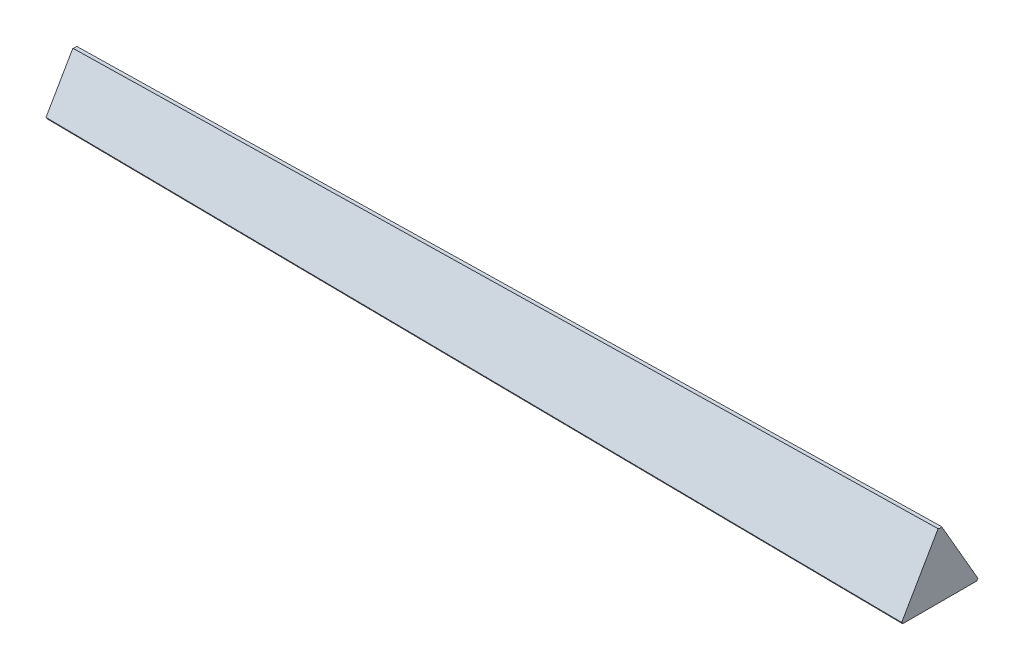
ISO-10303-21;
HEADER;
FILE_DESCRIPTION(('STEP AP214'),'2;1');
FILE_NAME('part.step','',(''),(''),'','','');
FILE_SCHEMA(('AUTOMOTIVE_DESIGN { 1 0 10303 214 1 1 1 1 }'));
ENDSEC;
DATA;
#1=APPLICATION_CONTEXT('core data for automotive mechanical design processes');
#2=APPLICATION_PROTOCOL_DEFINITION('international standard','automotive_design',2000,#1);
#3=PRODUCT_CONTEXT('',#1,'mechanical');
#4=PRODUCT('Part','Part','',(#3));
#5=PRODUCT_RELATED_PRODUCT_CATEGORY('part','',(#4));
#6=PRODUCT_DEFINITION_FORMATION('','',#4);
#7=PRODUCT_DEFINITION_CONTEXT('part definition',#1,'design');
#8=PRODUCT_DEFINITION('design','',#6,#7);
#9=PRODUCT_DEFINITION_SHAPE('','',#8);
#10=(LENGTH_UNIT() NAMED_UNIT(*) SI_UNIT(.MILLI.,.METRE.));
#11=(NAMED_UNIT(*) PLANE_ANGLE_UNIT() SI_UNIT($,.RADIAN.));
#12=(NAMED_UNIT(*) SI_UNIT($,.STERADIAN.) SOLID_ANGLE_UNIT());
#13=UNCERTAINTY_MEASURE_WITH_UNIT(LENGTH_MEASURE(1.E-05),#10,'distance_accuracy_value','');
#14=(GEOMETRIC_REPRESENTATION_CONTEXT(3) GLOBAL_UNCERTAINTY_ASSIGNED_CONTEXT((#13)) GLOBAL_UNIT_ASSIGNED_CONTEXT((#10,
#11,#12)) REPRESENTATION_CONTEXT('',''));
#15=CARTESIAN_POINT('',(0.,0.,0.));
#16=DIRECTION('',(0.,0.,1.));
#17=DIRECTION('',(1.,0.,0.));
#18=AXIS2_PLACEMENT_3D('',#15,#16,#17);
#19=CARTESIAN_POINT('',(3657.6,200.,0.));
#20=DIRECTION('',(-1.,0.,0.));
#21=DIRECTION('',(0.,-1.,0.));
#22=AXIS2_PLACEMENT_3D('',#19,#20,#21);
#23=PLANE('',#22);
#24=CARTESIAN_POINT('',(3657.6,0.,-55.1011032125769));
#25=DIRECTION('',(1.,0.,0.));
#26=DIRECTION('',(0.,1.,0.));
#27=AXIS2_PLACEMENT_3D('',#24,#25,#26);
#28=CIRCLE('',#27,2.667);
#29=CARTESIAN_POINT('',(3657.6,2.3094718557166,-53.7672258765175));
#30=VERTEX_POINT('',#29);
#31=CARTESIAN_POINT('',(3657.6,0.,-52.4341032125769));
#32=VERTEX_POINT('',#31);
#33=EDGE_CURVE('E135',#30,#32,#28,.T.);
#34=ORIENTED_EDGE('',*,*,#33,.F.);
#35=CARTESIAN_POINT('',(3657.6,0.,-55.1011032125769));
#36=CARTESIAN_POINT('',(3657.6,13.7742056459925,-47.1455610448161));
#37=CARTESIAN_POINT('',(3657.6,27.5484112919851,-39.1900188770553));
#38=CARTESIAN_POINT('',(3657.6,50.335832638563,-26.0287305910787));
#39=CARTESIAN_POINT('',(3657.6,59.3490483391484,-20.822984472863));
#40=CARTESIAN_POINT('',(3657.6,77.3754797403192,-10.4114922364315));
#41=CARTESIAN_POINT('',(3657.6,86.3886954409047,-5.20574611821575));
#42=CARTESIAN_POINT('',(3657.6,95.4019111414901,0.));
#43=B_SPLINE_CURVE_WITH_KNOTS('',3,(#35,#36,#37,#38,#39,#40,#41,#42),.UNSPECIFIED.,.F.,.F.,(4,2,
2,4),(0.,47.7197499076642,78.9453908012212,110.171031694778),.UNSPECIFIED.);
#44=CARTESIAN_POINT('',(3657.6,91.0689020407646,-2.50260795432091));
#45=VERTEX_POINT('',#44);
#46=EDGE_CURVE('E141',#30,#45,#43,.T.);
#47=ORIENTED_EDGE('',*,*,#46,.T.);
#48=CARTESIAN_POINT('',(3657.6,95.4019111414901,0.));
#49=DIRECTION('',(1.,0.,0.));
#50=DIRECTION('',(0.,1.,0.));
#51=AXIS2_PLACEMENT_3D('',#48,#49,#50);
#52=CIRCLE('',#51,5.0038);
#53=CARTESIAN_POINT('',(3657.6,91.0689020407646,2.5026079543209));
#54=VERTEX_POINT('',#53);
#55=EDGE_CURVE('E259',#54,#45,#52,.T.);
#56=ORIENTED_EDGE('',*,*,#55,.F.);
#57=CARTESIAN_POINT('',(3657.6,95.4019111414901,0.));
#58=CARTESIAN_POINT('',(3657.6,81.6277054954975,7.95554216776079));
#59=CARTESIAN_POINT('',(3657.6,67.853499849505,15.9110843355216));
#60=CARTESIAN_POINT('',(3657.6,45.066078502927,29.0723726214982));
#61=CARTESIAN_POINT('',(3657.6,36.0528628023416,34.278118739714));
#62=CARTESIAN_POINT('',(3657.6,18.0264314011708,44.6896109761454));
#63=CARTESIAN_POINT('',(3657.6,9.0132157005854,49.8953570943612));
#64=CARTESIAN_POINT('',(3657.6,0.,55.1011032125769));
#65=B_SPLINE_CURVE_WITH_KNOTS('',3,(#57,#58,#59,#60,#61,#62,#63,#64),.UNSPECIFIED.,.F.,.F.,(4,2,
2,4),(0.,47.7197499076642,78.9453908012212,110.171031694778),.UNSPECIFIED.);
#66=CARTESIAN_POINT('',(3657.6,2.30947185571662,53.7672258765175));
#67=VERTEX_POINT('',#66);
#68=EDGE_CURVE('E190',#54,#67,#65,.T.);
#69=ORIENTED_EDGE('',*,*,#68,.T.);
#70=CARTESIAN_POINT('',(3657.6,0.,55.1011032125769));
#71=DIRECTION('',(1.,0.,0.));
#72=DIRECTION('',(0.,1.,0.));
#73=AXIS2_PLACEMENT_3D('',#70,#71,#72);
#74=CIRCLE('',#73,2.667);
#75=CARTESIAN_POINT('',(3657.6,0.,52.4341032125769));
#76=VERTEX_POINT('',#75);
#77=EDGE_CURVE('E261',#76,#67,#74,.T.);
#78=ORIENTED_EDGE('',*,*,#77,.F.);
#79=DIRECTION('',(0.,0.,-1.));
#80=VECTOR('',#79,1.);
#81=CARTESIAN_POINT('',(3657.6,0.,0.));
#82=LINE('',#81,#80);
#83=EDGE_CURVE('E182',#76,#32,#82,.T.);
#84=ORIENTED_EDGE('',*,*,#83,.T.);
#85=EDGE_LOOP('',(#34,#47,#56,#69,#78,#84));
#86=FACE_BOUND('',#85,.T.);
#87=ADVANCED_FACE('F120',(#86),#23,.F.);
#88=CARTESIAN_POINT('',(2438.4,200.,0.));
#89=DIRECTION('',(-1.,0.,0.));
#90=DIRECTION('',(0.,-1.,0.));
#91=AXIS2_PLACEMENT_3D('',#88,#89,#90);
#92=PLANE('',#91);
#93=CARTESIAN_POINT('',(2438.4,0.,-41.6507354750513));
#94=CARTESIAN_POINT('',(2438.4,12.0168790157211,-34.7089462292094));
#95=CARTESIAN_POINT('',(2438.4,24.0337580314422,-27.7671569833675));
#96=CARTESIAN_POINT('',(2438.4,48.0675160628845,-13.8835784916838));
#97=CARTESIAN_POINT('',(2438.4,60.0843950786056,-6.94178924584188));
#98=CARTESIAN_POINT('',(2438.4,72.1012740943267,0.));
#99=B_SPLINE_CURVE_WITH_KNOTS('',3,(#93,#94,#95,#96,#97,#98),.UNSPECIFIED.,.F.,.F.,(4,2,4),(0.,
41.6334525701326,83.2669051402652),.UNSPECIFIED.);
#100=CARTESIAN_POINT('',(2438.4,2.30937006348012,-40.3166819116956));
#101=VERTEX_POINT('',#100);
#102=CARTESIAN_POINT('',(2438.4,67.7684559752259,-2.50293859029578));
#103=VERTEX_POINT('',#102);
#104=EDGE_CURVE('E187',#101,#103,#99,.T.);
#105=ORIENTED_EDGE('',*,*,#104,.F.);
#106=CARTESIAN_POINT('',(2438.4,0.,-41.6507354750512));
#107=DIRECTION('',(-1.,0.,0.));
#108=DIRECTION('',(0.,0.,1.));
#109=AXIS2_PLACEMENT_3D('',#106,#107,#108);
#110=CIRCLE('',#109,2.667);
#111=CARTESIAN_POINT('',(2438.4,0.,-38.9837354750512));
#112=VERTEX_POINT('',#111);
#113=EDGE_CURVE('E174',#112,#101,#110,.T.);
#114=ORIENTED_EDGE('',*,*,#113,.F.);
#115=DIRECTION('',(0.,0.,-1.));
#116=VECTOR('',#115,1.);
#117=CARTESIAN_POINT('',(2438.4,0.,0.));
#118=LINE('',#117,#116);
#119=CARTESIAN_POINT('',(2438.4,0.,38.9837354750512));
#120=VERTEX_POINT('',#119);
#121=EDGE_CURVE('E188',#120,#112,#118,.T.);
#122=ORIENTED_EDGE('',*,*,#121,.F.);
#123=CARTESIAN_POINT('',(2438.4,0.,41.6507354750512));
#124=DIRECTION('',(-1.,0.,0.));
#125=DIRECTION('',(0.,0.,1.));
#126=AXIS2_PLACEMENT_3D('',#123,#124,#125);
#127=CIRCLE('',#126,2.667);
#128=CARTESIAN_POINT('',(2438.4,2.30937006348016,40.3166819116957));
#129=VERTEX_POINT('',#128);
#130=EDGE_CURVE('E258',#129,#120,#127,.T.);
#131=ORIENTED_EDGE('',*,*,#130,.F.);
#132=CARTESIAN_POINT('',(2438.4,72.1012740943267,0.));
#133=CARTESIAN_POINT('',(2438.4,60.0843950786056,6.94178924584188));
#134=CARTESIAN_POINT('',(2438.4,48.0675160628845,13.8835784916837));
#135=CARTESIAN_POINT('',(2438.4,24.0337580314422,27.7671569833675));
#136=CARTESIAN_POINT('',(2438.4,12.0168790157211,34.7089462292094));
#137=CARTESIAN_POINT('',(2438.4,0.,41.6507354750513));
#138=B_SPLINE_CURVE_WITH_KNOTS('',3,(#132,#133,#134,#135,#136,#137),.UNSPECIFIED.,.F.,.F.,(4,2,
4),(0.,41.6334525701326,83.2669051402652),.UNSPECIFIED.);
#139=CARTESIAN_POINT('',(2438.4,67.7684559752259,2.50293859029572));
#140=VERTEX_POINT('',#139);
#141=EDGE_CURVE('E222',#140,#129,#138,.T.);
#142=ORIENTED_EDGE('',*,*,#141,.F.);
#143=CARTESIAN_POINT('',(2438.4,72.1012740943267,0.));
#144=DIRECTION('',(-1.,0.,0.));
#145=DIRECTION('',(0.,0.,1.));
#146=AXIS2_PLACEMENT_3D('',#143,#144,#145);
#147=CIRCLE('',#146,5.0038);
#148=EDGE_CURVE('E177',#103,#140,#147,.T.);
#149=ORIENTED_EDGE('',*,*,#148,.F.);
#150=EDGE_LOOP('',(#105,#114,#122,#131,#142,#149));
#151=FACE_BOUND('',#150,.T.);
#152=ADVANCED_FACE('F210',(#151),#92,.T.);
#153=CARTESIAN_POINT('',(0.,0.,-14.75));
#154=CARTESIAN_POINT('',(2438.33333333333,0.,-41.65));
#155=CARTESIAN_POINT('',(4876.66666666667,0.,-68.55));
#156=CARTESIAN_POINT('',(7315.,0.,-95.45));
#157=CARTESIAN_POINT('',(0.,2.125,-13.5208333333333));
#158=CARTESIAN_POINT('',(2438.33333333333,6.00833333333332,-38.1791666666667));
#159=CARTESIAN_POINT('',(4876.66666666667,9.89166666666665,-62.8375));
#160=CARTESIAN_POINT('',(7315.,13.775,-87.4958333333333));
#161=CARTESIAN_POINT('',(0.,6.37500000000001,-11.0625));
#162=CARTESIAN_POINT('',(2438.33333333334,18.025,-31.2375));
#163=CARTESIAN_POINT('',(4876.66666666667,29.6750000000001,-51.4125000000001));
#164=CARTESIAN_POINT('',(7315.00000000001,41.3250000000001,-71.5875));
#165=CARTESIAN_POINT('',(0.,12.75,-7.37499999999997));
#166=CARTESIAN_POINT('',(2438.33333333333,36.05,-20.825));
#167=CARTESIAN_POINT('',(4876.66666666666,59.3499999999999,-34.275));
#168=CARTESIAN_POINT('',(7314.99999999999,82.6499999999999,-47.725));
#169=CARTESIAN_POINT('',(0.,19.125,-3.68750000000001));
#170=CARTESIAN_POINT('',(2438.33333333333,54.075,-10.4125));
#171=CARTESIAN_POINT('',(4876.66666666667,89.025,-17.1375));
#172=CARTESIAN_POINT('',(7315.,123.975,-23.8625));
#173=CARTESIAN_POINT('',(0.,23.375,-1.22916666666666));
#174=CARTESIAN_POINT('',(2438.33333333333,66.0916666666667,-3.47083333333334));
#175=CARTESIAN_POINT('',(4876.66666666667,108.808333333333,-5.71250000000001));
#176=CARTESIAN_POINT('',(7315.,151.525,-7.95416666666669));
#177=CARTESIAN_POINT('',(0.,25.5,0.));
#178=CARTESIAN_POINT('',(2438.33333333333,72.1,0.));
#179=CARTESIAN_POINT('',(4876.66666666667,118.7,0.));
#180=CARTESIAN_POINT('',(7315.,165.3,0.));
#181=B_SPLINE_SURFACE_WITH_KNOTS('',3,3,((#153,#154,#155,#156),(#157,#158,#159,#160),(#161,#162,
#163,#164),(#165,#166,#167,#168),(#169,#170,#171,#172),(#173,#174,#175,#176),(#177,#178,#179,
#180)),.UNSPECIFIED.,.F.,.F.,.F.,(4,1,1,1,4),(4,4),(0.666750709304579,0.750063031978434,
0.833375354652289,0.916687677326145,1.),(0.,1.),.UNSPECIFIED.);
#182=CARTESIAN_POINT('',(3657.6,2.3094718557166,-53.7672258765175));
#183=CARTESIAN_POINT('',(3655.82232454747,2.30947174354873,-53.7476141431416));
#184=CARTESIAN_POINT('',(3654.04464909494,2.30947163126102,-53.7280024095582));
#185=CARTESIAN_POINT('',(3645.15627183229,2.30947106922134,-53.6299437406012));
#186=CARTESIAN_POINT('',(3638.04557002222,2.30947061766597,-53.5514968021063));
#187=CARTESIAN_POINT('',(3623.82416640214,2.30946971065826,-53.3946029183721));
#188=CARTESIAN_POINT('',(3616.71346459214,2.30946925520591,-53.3161559731327));
#189=CARTESIAN_POINT('',(3602.49206097221,2.30946834035357,-53.1592620758218));
#190=CARTESIAN_POINT('',(3595.38135916228,2.30946788095358,-53.0808151237502));
#191=CARTESIAN_POINT('',(3581.1599555425,2.30946695815439,-52.9239212126856));
#192=CARTESIAN_POINT('',(3574.04925373265,2.30946649475521,-52.8454742536927));
#193=CARTESIAN_POINT('',(3559.82785011303,2.30946556390519,-52.6885803286946));
#194=CARTESIAN_POINT('',(3552.71714830325,2.30946509645436,-52.6101333626895));
#195=CARTESIAN_POINT('',(3538.49574468379,2.3094641574477,-52.4532394235749));
#196=CARTESIAN_POINT('',(3531.38504287409,2.30946368589187,-52.3747924504653));
#197=CARTESIAN_POINT('',(3520.71899015961,2.30946297543861,-52.2571219854021));
#198=CARTESIAN_POINT('',(3517.16363925479,2.30946273810094,-52.2178984961479));
#199=CARTESIAN_POINT('',(3506.49758654037,2.30946202451785,-52.100228025668));
#200=CARTESIAN_POINT('',(3499.38688473079,2.30946154670234,-52.021781041725));
#201=CARTESIAN_POINT('',(3485.16548111172,2.30946058682874,-51.8648870664964));
#202=CARTESIAN_POINT('',(3478.05477930223,2.30946010477065,-51.7864400752109));
#203=CARTESIAN_POINT('',(3463.83337568332,2.3094591363551,-51.6295460851992));
#204=CARTESIAN_POINT('',(3456.72267387391,2.30945864999764,-51.5510990864729));
#205=CARTESIAN_POINT('',(3446.05662115985,2.30945791719359,-51.433428582728));
#206=CARTESIAN_POINT('',(3442.50127025518,2.30945767238093,-51.3942050805371));
#207=CARTESIAN_POINT('',(3431.83521754118,2.30945693629803,-51.2765345711176));
#208=CARTESIAN_POINT('',(3424.72451573189,2.30945644338289,-51.1980875610423));
#209=CARTESIAN_POINT('',(3410.50311211341,2.30945545310684,-51.0411935331976));
#210=CARTESIAN_POINT('',(3403.3924103042,2.30945495574594,-50.9627465154283));
#211=CARTESIAN_POINT('',(3389.17100668588,2.30945395651795,-50.805852472091));
#212=CARTESIAN_POINT('',(3382.06030487677,2.30945345465087,-50.7274054465231));
#213=CARTESIAN_POINT('',(3367.83890125862,2.30945244634903,-50.5705113874823));
#214=CARTESIAN_POINT('',(3360.72819944959,2.30945193991427,-50.4920643540095));
#215=CARTESIAN_POINT('',(3350.06214673612,2.30945117678935,-50.3743937977901));
#216=CARTESIAN_POINT('',(3346.50679583163,2.30945092183559,-50.3351702780487));
#217=CARTESIAN_POINT('',(3335.84074311822,2.30945015522599,-50.2174997157986));
#218=CARTESIAN_POINT('',(3328.73004130933,2.30944964182186,-50.1390526702644));
#219=CARTESIAN_POINT('',(3314.50863769163,2.30944861028716,-49.9821585710164));
#220=CARTESIAN_POINT('',(3307.39793588282,2.3094480921566,-49.9037115173025));
#221=CARTESIAN_POINT('',(3293.1765322653,2.30944705110339,-49.7468174015817));
#222=CARTESIAN_POINT('',(3286.06583045659,2.30944652818075,-49.6683703395747));
#223=CARTESIAN_POINT('',(3271.84442683925,2.30944547747668,-49.511476207152));
#224=CARTESIAN_POINT('',(3264.73372503063,2.30944494969526,-49.4330291367364));
#225=CARTESIAN_POINT('',(3254.06767231777,2.30944415432795,-49.3153585247181));
#226=CARTESIAN_POINT('',(3250.51232141349,2.30944388858964,-49.2761349863128));
#227=CARTESIAN_POINT('',(3239.8462687007,2.30944308951422,-49.1584643678773));
#228=CARTESIAN_POINT('',(3232.73556689222,2.30944255431657,-49.0800172846272));
#229=CARTESIAN_POINT('',(3218.51416327536,2.30944147888997,-48.92312310942));
#230=CARTESIAN_POINT('',(3211.40346146697,2.30944093866102,-48.8446760174628));
#231=CARTESIAN_POINT('',(3197.1820578503,2.30943985310054,-48.6877818247181));
#232=CARTESIAN_POINT('',(3190.07135604202,2.309439307769,-48.6093347239306));
#233=CARTESIAN_POINT('',(3179.40530332966,2.30943848589022,-48.4916640660321));
#234=CARTESIAN_POINT('',(3175.84995242556,2.30943821128371,-48.4524405122798));
#235=CARTESIAN_POINT('',(3165.18389971328,2.30943738550966,-48.3347698476403));
#236=CARTESIAN_POINT('',(3158.07319790514,2.30943683238758,-48.2563227333708));
#237=CARTESIAN_POINT('',(3143.85179428896,2.30943572085665,-48.0994284956825));
#238=CARTESIAN_POINT('',(3136.74109248093,2.3094351624478,-48.0209813722639));
#239=CARTESIAN_POINT('',(3122.51968886496,2.30943404026713,-47.8640871161457));
#240=CARTESIAN_POINT('',(3115.40898705702,2.30943347649531,-47.7856399834462));
#241=CARTESIAN_POINT('',(3101.18758344126,2.30943234351111,-47.6287457086321));
#242=CARTESIAN_POINT('',(3094.07688163343,2.30943177429872,-47.5502985665174));
#243=CARTESIAN_POINT('',(3083.41082892176,2.30943091634031,-47.4326278461814));
#244=CARTESIAN_POINT('',(3079.85547801789,2.3094306296642,-47.393404271542));
#245=CARTESIAN_POINT('',(3069.1894253063,2.30942976755091,-47.2757335440158));
#246=CARTESIAN_POINT('',(3062.07872349863,2.30942919002877,-47.1972863875209));
#247=CARTESIAN_POINT('',(3047.85731988339,2.30942802934316,-47.0403920647687));
#248=CARTESIAN_POINT('',(3040.74661807583,2.30942744617969,-46.9619448985114));
#249=CARTESIAN_POINT('',(3026.52521446081,2.30942627412836,-46.8050505560905));
#250=CARTESIAN_POINT('',(3019.41451265335,2.30942568524051,-46.7266033799271));
#251=CARTESIAN_POINT('',(3005.19310903855,2.30942450165571,-46.5697090175475));
#252=CARTESIAN_POINT('',(2998.08240723121,2.30942390695876,-46.4912618313314));
#253=CARTESIAN_POINT('',(2987.41635452028,2.3094230104917,-46.3735910443555));
#254=CARTESIAN_POINT('',(2983.86100361665,2.30942271093241,-46.3343674474217));
#255=CARTESIAN_POINT('',(2973.1949509058,2.30942181002728,-46.2166966527658));
#256=CARTESIAN_POINT('',(2966.08424909863,2.30942120645418,-46.1382494511895));
#257=CARTESIAN_POINT('',(2951.86284548439,2.30941999327969,-45.9813550376051));
#258=CARTESIAN_POINT('',(2944.75214367733,2.30941938367831,-45.902907825597));
#259=CARTESIAN_POINT('',(2930.53074006333,2.30941815835651,-45.746013390992));
#260=CARTESIAN_POINT('',(2923.42003825639,2.30941754263609,-45.667566168395));
#261=CARTESIAN_POINT('',(2912.75398554606,2.30941661439667,-45.5498953264376));
#262=CARTESIAN_POINT('',(2909.19863464264,2.30941630420707,-45.5106717111082));
#263=CARTESIAN_POINT('',(2898.5325819324,2.30941537129125,-45.3930008610586));
#264=CARTESIAN_POINT('',(2891.42188012564,2.30941474621801,-45.3145536222769));
#265=CARTESIAN_POINT('',(2877.20047651223,2.30941348971748,-45.1576591337181));
#266=CARTESIAN_POINT('',(2870.08977470559,2.3094128582902,-45.079211883941));
#267=CARTESIAN_POINT('',(2855.86837109243,2.30941158898417,-44.9223173732229));
#268=CARTESIAN_POINT('',(2848.75766928591,2.30941095110542,-44.8438701122818));
#269=CARTESIAN_POINT('',(2834.53626567299,2.30940966879706,-44.686975579064));
#270=CARTESIAN_POINT('',(2827.4255638666,2.30940902436745,-44.6085283067872));
#271=CARTESIAN_POINT('',(2816.7595111571,2.30940805273382,-44.4908573897384));
#272=CARTESIAN_POINT('',(2813.20416025396,2.30940772802441,-44.4516337492832));
#273=CARTESIAN_POINT('',(2802.53810754456,2.30940675138222,-44.3339628235675));
#274=CARTESIAN_POINT('',(2795.42740573835,2.30940609693548,-44.2555155339567));
#275=CARTESIAN_POINT('',(2781.20600212608,2.30940478123368,-44.0986209429539));
#276=CARTESIAN_POINT('',(2774.09530032,2.3094041199786,-44.0201736415618));
#277=CARTESIAN_POINT('',(2759.87389670799,2.30940279055322,-43.8632790268116));
#278=CARTESIAN_POINT('',(2752.76319490205,2.30940212238292,-43.7848317134534));
#279=CARTESIAN_POINT('',(2738.5417912903,2.30940077901813,-43.6279370745824));
#280=CARTESIAN_POINT('',(2731.43108948449,2.30940010382364,-43.5494897490695));
#281=CARTESIAN_POINT('',(2720.76503677588,2.30939908568015,-43.4318187515396));
#282=CARTESIAN_POINT('',(2717.20968587303,2.30939874540703,-43.3925950841529));
#283=CARTESIAN_POINT('',(2706.54363316453,2.30939772189059,-43.2749240773257));
#284=CARTESIAN_POINT('',(2699.43293135892,2.30939703595021,-43.1964767332183));
#285=CARTESIAN_POINT('',(2685.21152774786,2.30939565676239,-43.0395820323595));
#286=CARTESIAN_POINT('',(2678.1008259424,2.30939496351494,-42.9611346756082));
#287=CARTESIAN_POINT('',(2663.87942233161,2.30939356959562,-42.8042399492585));
#288=CARTESIAN_POINT('',(2656.76872052629,2.30939286892375,-42.7257925796602));
#289=CARTESIAN_POINT('',(2646.10266781842,2.30939181225764,-42.6081215154717));
#290=CARTESIAN_POINT('',(2642.54731691581,2.30939145909255,-42.5688978257771));
#291=CARTESIAN_POINT('',(2631.88126420805,2.30939039674527,-42.4512267517582));
#292=CARTESIAN_POINT('',(2624.77056240295,2.30938968471104,-42.372779362499));
#293=CARTESIAN_POINT('',(2610.54915879289,2.30938825291354,-42.2158845706067));
#294=CARTESIAN_POINT('',(2603.43845698793,2.30938753315027,-42.1374371679735));
#295=CARTESIAN_POINT('',(2589.21705337817,2.30938608576802,-41.9805423491142));
#296=CARTESIAN_POINT('',(2582.10635157336,2.30938535814906,-41.9020949328881));
#297=CARTESIAN_POINT('',(2567.8849479639,2.30938389492622,-41.7452000866195));
#298=CARTESIAN_POINT('',(2560.77424615925,2.30938315932236,-41.6667526565769));
#299=CARTESIAN_POINT('',(2550.10819345238,2.30938204982863,-41.549081500979));
#300=CARTESIAN_POINT('',(2546.55284255011,2.30938167898273,-41.5098577806907));
#301=CARTESIAN_POINT('',(2535.88678984336,2.30938056337591,-41.3921866145153));
#302=CARTESIAN_POINT('',(2528.77608803894,2.30937981554584,-41.3137391633176));
#303=CARTESIAN_POINT('',(2514.55468443026,2.30937831156482,-41.1568442465246));
#304=CARTESIAN_POINT('',(2507.443982626,2.30937755541386,-41.0783967809293));
#305=CARTESIAN_POINT('',(2493.22257901764,2.3093760346514,-40.9215018350995));
#306=CARTESIAN_POINT('',(2486.11187721354,2.30937527003988,-40.843054354865));
#307=CARTESIAN_POINT('',(2472.23431284112,2.30937376939455,-40.6899527215657));
#308=CARTESIAN_POINT('',(2465.46745027279,2.30937303376668,-40.6152985692033));
#309=CARTESIAN_POINT('',(2451.93372513628,2.30937155459327,-40.4659902507789));
#310=CARTESIAN_POINT('',(2445.1668625681,2.30937081104772,-40.3913360847169));
#311=CARTESIAN_POINT('',(2438.4,2.30937006348015,-40.3166819116957));
#312=B_SPLINE_CURVE_WITH_KNOTS('',3,(#182,#183,#184,#185,#186,#187,#188,#189,#190,#191,#192,
#193,#194,#195,#196,#197,#198,#199,#200,#201,#202,#203,#204,#205,#206,#207,#208,#209,#210,#211,
#212,#213,#214,#215,#216,#217,#218,#219,#220,#221,#222,#223,#224,#225,#226,#227,#228,#229,#230,
#231,#232,#233,#234,#235,#236,#237,#238,#239,#240,#241,#242,#243,#244,#245,#246,#247,#248,#249,
#250,#251,#252,#253,#254,#255,#256,#257,#258,#259,#260,#261,#262,#263,#264,#265,#266,#267,#268,
#269,#270,#271,#272,#273,#274,#275,#276,#277,#278,#279,#280,#281,#282,#283,#284,#285,#286,#287,
#288,#289,#290,#291,#292,#293,#294,#295,#296,#297,#298,#299,#300,#301,#302,#303,#304,#305,#306,
#307,#308,#309,#310,#311),.UNSPECIFIED.,.F.,.F.,(4,2,2,2,2,2,2,2,2,2,2,2,2,2,2,2,2,2,2,2,2,2,2,
2,2,2,2,2,2,2,2,2,2,2,2,2,2,2,2,2,2,2,2,2,2,2,2,2,2,2,2,2,2,2,2,2,2,2,2,2,2,2,2,2,4),(0.,
5.33335088960192,26.6667544480092,48.0001580064177,69.3335615648268,90.6669651232344,
112.000368681642,133.33377224005,144.000474019255,165.333877577664,186.667281136072,
208.00068469448,218.667386473685,240.000790032094,261.334193590502,282.667597148911,
304.00100070732,314.667702486523,336.001106044931,357.334509603339,378.667913161747,
400.001316720155,410.668018499359,432.001422057768,453.334825616176,474.668229174584,
485.334930953788,506.668334512196,528.001738070604,549.335141629012,570.66854518742,
581.335246966624,602.668650525033,624.00205408344,645.335457641849,666.668861200257,
677.335562979461,698.668966537869,720.002370096277,741.335773654686,752.00247543389,
773.335878992298,794.669282550706,816.002686109113,837.336089667521,848.002791446724,
869.336195005132,890.66959856354,912.003002121948,933.336405680355,944.00310745956,
965.336511017967,986.669914576375,1008.00331813478,1018.67001991399,1040.0034234724,
1061.3368270308,1082.67023058921,1104.00363414762,1114.67033592682,1136.00373948523,
1157.33714304364,1178.67054660205,1198.97236968152,1219.27419276099),.UNSPECIFIED.);
#313=EDGE_CURVE('E171',#30,#101,#312,.T.);
#314=CARTESIAN_POINT('',(2438.4,67.7684559752259,-2.50293859029577));
#315=CARTESIAN_POINT('',(2441.73431010851,67.8321786680095,-2.50293739392342));
#316=CARTESIAN_POINT('',(2445.06862021698,67.8959013626246,-2.50293620072151));
#317=CARTESIAN_POINT('',(2461.74017075916,68.2145148447864,-2.50293025044171));
#318=CARTESIAN_POINT('',(2475.07741119236,68.4694056595929,-2.5029255405531));
#319=CARTESIAN_POINT('',(2501.75189205767,68.9791873455487,-2.50291621831251));
#320=CARTESIAN_POINT('',(2515.08913248978,69.2340782166981,-2.50291160596053));
#321=CARTESIAN_POINT('',(2541.76361335297,69.743860013608,-2.5029024757963));
#322=CARTESIAN_POINT('',(2555.10085378404,69.9987509393685,-2.50289795798405));
#323=CARTESIAN_POINT('',(2581.77533464518,70.5085328438378,-2.50288901402171));
#324=CARTESIAN_POINT('',(2595.11257507524,70.7634238225466,-2.50288458787163));
#325=CARTESIAN_POINT('',(2621.78705593438,71.2732058313169,-2.50287582447227));
#326=CARTESIAN_POINT('',(2635.12429636346,71.5280968613784,-2.50287148722298));
#327=CARTESIAN_POINT('',(2661.79877722066,72.0378789713219,-2.50286289897347));
#328=CARTESIAN_POINT('',(2675.13601764879,72.2927700512038,-2.50285864797324));
#329=CARTESIAN_POINT('',(2701.81049850412,72.8025522593162,-2.50285022967461));
#330=CARTESIAN_POINT('',(2715.14773893132,73.0574433875466,-2.50284606237621));
#331=CARTESIAN_POINT('',(2741.82221978483,73.5672256909417,-2.50283780903326));
#332=CARTESIAN_POINT('',(2755.15946021114,73.8221168661062,-2.5028337229887));
#333=CARTESIAN_POINT('',(2781.83394106288,74.3318992620096,-2.50282562980006));
#334=CARTESIAN_POINT('',(2795.17118148832,74.5867904827484,-2.50282162265598));
#335=CARTESIAN_POINT('',(2821.84566233834,75.0965729684924,-2.50281368500485));
#336=CARTESIAN_POINT('',(2835.18290276293,75.3514642334976,-2.50280975449781));
#337=CARTESIAN_POINT('',(2861.85738361129,75.8612468065162,-2.50280196794315));
#338=CARTESIAN_POINT('',(2875.19462403506,76.1161381145297,-2.50279811189553));
#339=CARTESIAN_POINT('',(2901.86910488179,76.6259207723537,-2.50279047216373));
#340=CARTESIAN_POINT('',(2915.20634530476,76.8808121221643,-2.50278668847955));
#341=CARTESIAN_POINT('',(2941.88082614992,77.3905948624169,-2.50277919145685));
#342=CARTESIAN_POINT('',(2955.21806657212,77.6454862528588,-2.50277547811831));
#343=CARTESIAN_POINT('',(2981.89254741574,78.1552690732506,-2.50276811984258));
#344=CARTESIAN_POINT('',(2995.22978783718,78.4101605032004,-2.50276447490539));
#345=CARTESIAN_POINT('',(3015.23564846879,78.7924976769457,-2.50275905739786));
#346=CARTESIAN_POINT('',(3021.90426867923,78.9199434063309,-2.50275725987839));
#347=CARTESIAN_POINT('',(3041.91012931029,79.3022806086994,-2.50275189192765));
#348=CARTESIAN_POINT('',(3055.24736973063,79.5571720958957,-2.50274834610402));
#349=CARTESIAN_POINT('',(3081.92185057061,80.0669551071641,-2.50274131830237));
#350=CARTESIAN_POINT('',(3095.25909099025,80.3218466312362,-2.50273783632434));
#351=CARTESIAN_POINT('',(3121.93357182884,80.8316297152692,-2.50273093450559));
#352=CARTESIAN_POINT('',(3135.27081224779,81.0865212752301,-2.50272751466487));
#353=CARTESIAN_POINT('',(3161.94529308503,81.5963044300883,-2.50272073547202));
#354=CARTESIAN_POINT('',(3175.28253350332,81.8511960249855,-2.50271737611989));
#355=CARTESIAN_POINT('',(3201.95701433924,82.3609792487972,-2.50271071631353));
#356=CARTESIAN_POINT('',(3215.29425475687,82.6158708777116,-2.50270741585929));
#357=CARTESIAN_POINT('',(3241.96873559151,83.1256541686708,-2.50270087231325));
#358=CARTESIAN_POINT('',(3255.30597600851,83.3805458307155,-2.50269762922145));
#359=CARTESIAN_POINT('',(3281.9804568419,83.8903291870786,-2.50269119891778));
#360=CARTESIAN_POINT('',(3295.31769725828,84.145220881397,-2.50268801170592));
#361=CARTESIAN_POINT('',(3321.99217809045,84.6550043014803,-2.50268169173019));
#362=CARTESIAN_POINT('',(3335.32941850623,84.9098960272451,-2.50267855896632));
#363=CARTESIAN_POINT('',(3362.00389933722,85.4196795094221,-2.50267234650331));
#364=CARTESIAN_POINT('',(3375.34113975241,85.6745712658343,-2.50266926680418));
#365=CARTESIAN_POINT('',(3402.01562058224,86.1843548085334,-2.50266315913335));
#366=CARTESIAN_POINT('',(3415.35286099687,86.4392465948202,-2.50266013116165));
#367=CARTESIAN_POINT('',(3435.35872161839,86.8215842960974,-2.50265562703151));
#368=CARTESIAN_POINT('',(3442.02734182549,86.9490302001642,-2.50265413195937));
#369=CARTESIAN_POINT('',(3462.0332024466,87.3313679231516,-2.50264966542042));
#370=CARTESIAN_POINT('',(3475.3704428604,87.5862597528591,-2.50264671263112));
#371=CARTESIAN_POINT('',(3502.04492368746,88.096043440328,-2.5026408556283));
#372=CARTESIAN_POINT('',(3515.38216410072,88.3509352980895,-2.50263795141479));
#373=CARTESIAN_POINT('',(3542.05664492672,88.8607190409805,-2.50263219037592));
#374=CARTESIAN_POINT('',(3555.39388533946,89.11561092611,-2.50262933355058));
#375=CARTESIAN_POINT('',(3583.5426047939,89.6535693282706,-2.50262335290909));
#376=CARTESIAN_POINT('',(3598.35408383555,89.9366358484163,-2.50262023448597));
#377=CARTESIAN_POINT('',(3627.97704191823,90.5027689207654,-2.50261405314917));
#378=CARTESIAN_POINT('',(3642.78852095926,90.7858354729688,-2.50261099023548));
#379=CARTESIAN_POINT('',(3657.6,91.0689020407646,-2.50260795432093));
#380=B_SPLINE_CURVE_WITH_KNOTS('',3,(#314,#315,#316,#317,#318,#319,#320,#321,#322,#323,#324,
#325,#326,#327,#328,#329,#330,#331,#332,#333,#334,#335,#336,#337,#338,#339,#340,#341,#342,#343,
#344,#345,#346,#347,#348,#349,#350,#351,#352,#353,#354,#355,#356,#357,#358,#359,#360,#361,#362,
#363,#364,#365,#366,#367,#368,#369,#370,#371,#372,#373,#374,#375,#376,#377,#378,#379),
.UNSPECIFIED.,.F.,.F.,(4,2,2,2,2,2,2,2,2,2,2,2,2,2,2,2,2,2,2,2,2,2,2,2,2,2,2,2,2,2,2,2,4),(0.,
10.0047568851728,50.0237844258645,90.0428119665568,130.061839507248,170.08086704794,
210.099894588632,250.118922129324,290.137949670015,330.156977210708,370.176004751399,
410.19503229209,450.214059832782,490.233087373474,530.252114914166,570.271142454858,
590.280656225202,630.299683765893,670.318711306585,710.337738847277,750.356766387968,
790.375793928661,830.394821469352,870.413849010045,910.432876550736,950.451904091427,
990.470931632119,1010.48044540246,1050.49947294316,1090.51850048385,1130.53752802454,
1174.9800790596,1219.42263009466),.UNSPECIFIED.);
#381=EDGE_CURVE('E128',#103,#45,#380,.T.);
#382=ORIENTED_EDGE('',*,*,#46,.F.);
#383=ORIENTED_EDGE('',*,*,#313,.T.);
#384=ORIENTED_EDGE('',*,*,#104,.T.);
#385=ORIENTED_EDGE('',*,*,#381,.T.);
#386=EDGE_LOOP('',(#382,#383,#384,#385));
#387=FACE_BOUND('',#386,.T.);
#388=ADVANCED_FACE('F185',(#387),#181,.T.);
#389=CARTESIAN_POINT('',(0.,0.,14.75));
#390=DIRECTION('',(0.,-1.,0.));
#391=DIRECTION('',(0.,0.,-1.));
#392=AXIS2_PLACEMENT_3D('',#389,#390,#391);
#393=PLANE('',#392);
#394=ORIENTED_EDGE('',*,*,#121,.T.);
#395=DIRECTION('',(-0.999939151654741,0.,0.0110314544823701));
#396=VECTOR('',#395,1.);
#397=CARTESIAN_POINT('',(3048.,0.,-45.7089193438141));
#398=LINE('',#397,#396);
#399=EDGE_CURVE('E13',#112,#32,#398,.F.);
#400=ORIENTED_EDGE('',*,*,#399,.T.);
#401=ORIENTED_EDGE('',*,*,#83,.F.);
#402=DIRECTION('',(-0.999939151654741,0.,-0.0110314544823701));
#403=VECTOR('',#402,1.);
#404=CARTESIAN_POINT('',(3048.,0.,45.7089193438141));
#405=LINE('',#404,#403);
#406=EDGE_CURVE('E271',#76,#120,#405,.T.);
#407=ORIENTED_EDGE('',*,*,#406,.T.);
#408=EDGE_LOOP('',(#394,#400,#401,#407));
#409=FACE_BOUND('',#408,.T.);
#410=ADVANCED_FACE('F122',(#409),#393,.T.);
#411=CARTESIAN_POINT('',(0.,25.5,0.));
#412=CARTESIAN_POINT('',(2438.33333333333,72.1,0.));
#413=CARTESIAN_POINT('',(4876.66666666667,118.7,0.));
#414=CARTESIAN_POINT('',(7315.,165.3,0.));
#415=CARTESIAN_POINT('',(0.,23.375,1.22916666666666));
#416=CARTESIAN_POINT('',(2438.33333333333,66.0916666666667,3.47083333333334));
#417=CARTESIAN_POINT('',(4876.66666666667,108.808333333333,5.71250000000001));
#418=CARTESIAN_POINT('',(7315.,151.525,7.95416666666669));
#419=CARTESIAN_POINT('',(0.,19.125,3.68749999999999));
#420=CARTESIAN_POINT('',(2438.33333333333,54.075,10.4125));
#421=CARTESIAN_POINT('',(4876.66666666667,89.0250000000001,17.1375));
#422=CARTESIAN_POINT('',(7315.,123.975,23.8625));
#423=CARTESIAN_POINT('',(0.,12.75,7.37500000000001));
#424=CARTESIAN_POINT('',(2438.33333333333,36.0499999999999,20.825));
#425=CARTESIAN_POINT('',(4876.66666666667,59.3499999999999,34.275));
#426=CARTESIAN_POINT('',(7315.,82.6499999999999,47.725));
#427=CARTESIAN_POINT('',(0.,6.375,11.0625));
#428=CARTESIAN_POINT('',(2438.33333333333,18.025,31.2375));
#429=CARTESIAN_POINT('',(4876.66666666666,29.675,51.4125));
#430=CARTESIAN_POINT('',(7314.99999999999,41.3250000000001,71.5875));
#431=CARTESIAN_POINT('',(0.,2.125,13.5208333333333));
#432=CARTESIAN_POINT('',(2438.33333333333,6.00833333333333,38.1791666666667));
#433=CARTESIAN_POINT('',(4876.66666666667,9.89166666666667,62.8375));
#434=CARTESIAN_POINT('',(7315.,13.775,87.4958333333333));
#435=CARTESIAN_POINT('',(0.,0.,14.75));
#436=CARTESIAN_POINT('',(2438.33333333333,0.,41.65));
#437=CARTESIAN_POINT('',(4876.66666666667,0.,68.55));
#438=CARTESIAN_POINT('',(7315.,0.,95.45));
#439=B_SPLINE_SURFACE_WITH_KNOTS('',3,3,((#411,#412,#413,#414),(#415,#416,#417,#418),(#419,#420,
#421,#422),(#423,#424,#425,#426),(#427,#428,#429,#430),(#431,#432,#433,#434),(#435,#436,#437,
#438)),.UNSPECIFIED.,.F.,.F.,.F.,(4,1,1,1,4),(4,4),(0.,0.0833123226738553,0.166624645347711,
0.249936968021566,0.333249290695421),(0.,1.),.UNSPECIFIED.);
#440=CARTESIAN_POINT('',(3657.6,91.0689020407646,2.50260795432089));
#441=CARTESIAN_POINT('',(3654.26568989715,91.0051790517099,2.5026086377537));
#442=CARTESIAN_POINT('',(3650.93137979429,90.9414560634458,2.5026093225555));
#443=CARTESIAN_POINT('',(3634.25982927992,90.6228411261028,2.50261275345162));
#444=CARTESIAN_POINT('',(3620.92258886817,90.3679491889562,2.50261552020721));
#445=CARTESIAN_POINT('',(3594.24810804419,89.8581653407408,2.50262109887337));
#446=CARTESIAN_POINT('',(3580.91086763195,89.603273429672,2.50262391078394));
#447=CARTESIAN_POINT('',(3554.23638680695,89.0934896342563,2.50262958087493));
#448=CARTESIAN_POINT('',(3540.8991463942,88.8385977499094,2.50263243905536));
#449=CARTESIAN_POINT('',(3514.22466556817,88.3288140086027,2.50263820283745));
#450=CARTESIAN_POINT('',(3500.88742515489,88.0739221516429,2.50264110843912));
#451=CARTESIAN_POINT('',(3474.2129443278,87.5641384657979,2.50264696825378));
#452=CARTESIAN_POINT('',(3460.87570391399,87.3092466369127,2.50264992246676));
#453=CARTESIAN_POINT('',(3434.20122308581,86.7994630079274,2.50265588073419));
#454=CARTESIAN_POINT('',(3420.86398267145,86.5445712078273,2.50265888478863));
#455=CARTESIAN_POINT('',(3394.18950184216,86.0347876371473,2.50266494401105));
#456=CARTESIAN_POINT('',(3380.85226142723,85.7798958665674,2.50266799917902));
#457=CARTESIAN_POINT('',(3354.1777805968,85.2701123556877,2.50267416194416));
#458=CARTESIAN_POINT('',(3340.84054018129,85.0152206153879,2.50267726954132));
#459=CARTESIAN_POINT('',(3314.16605934968,84.5054371658548,2.50268353852612));
#460=CARTESIAN_POINT('',(3300.82881893358,84.2505454566216,2.50268669991374));
#461=CARTESIAN_POINT('',(3274.15433810078,83.7407620700356,2.5026930778882));
#462=CARTESIAN_POINT('',(3260.81709768407,83.4858703926828,2.50269629447503));
#463=CARTESIAN_POINT('',(3234.14261685002,82.9760870707002,2.50270278430631));
#464=CARTESIAN_POINT('',(3220.80537643269,82.7211954260705,2.50270605755076));
#465=CARTESIAN_POINT('',(3194.13089559738,82.2114121704064,2.50271266220749));
#466=CARTESIAN_POINT('',(3180.7936551794,81.9565205593721,2.50271599361977));
#467=CARTESIAN_POINT('',(3154.11917434279,81.4467373718029,2.50272271617667));
#468=CARTESIAN_POINT('',(3140.78193392415,81.191845795268,2.5027261073213));
#469=CARTESIAN_POINT('',(3114.1074530862,80.6820626776337,2.50273295096328));
#470=CARTESIAN_POINT('',(3100.77021266689,80.4271711365343,2.50273640346063));
#471=CARTESIAN_POINT('',(3080.7643520374,80.044833852191,2.50274162948309));
#472=CARTESIAN_POINT('',(3074.09573182748,79.9173880952941,2.50274337936998));
#473=CARTESIAN_POINT('',(3054.08987119746,79.5350508384435,2.50274865299252));
#474=CARTESIAN_POINT('',(3040.7526307771,79.2801593523295,2.50275220069002));
#475=CARTESIAN_POINT('',(3014.07814993565,78.7703764180315,2.50275936175518));
#476=CARTESIAN_POINT('',(3000.74090951456,78.5154849698475,2.50276297512283));
#477=CARTESIAN_POINT('',(2974.06642867164,78.0057021124732,2.50277026936929));
#478=CARTESIAN_POINT('',(2960.7291882498,77.7508107032828,2.50277395024811));
#479=CARTESIAN_POINT('',(2934.05470740537,77.2410279249989,2.50278138142655));
#480=CARTESIAN_POINT('',(2920.71746698277,76.9861365559055,2.50278513172618));
#481=CARTESIAN_POINT('',(2894.04298613678,76.4763538589612,2.50279270372884));
#482=CARTESIAN_POINT('',(2880.70574571339,76.2214625311102,2.50279652543186));
#483=CARTESIAN_POINT('',(2854.03126486581,75.7116799178403,2.50280424230005));
#484=CARTESIAN_POINT('',(2840.69402444161,75.4567886324214,2.5028081374652));
#485=CARTESIAN_POINT('',(2814.01954359237,74.9470061052511,2.50281600339633));
#486=CARTESIAN_POINT('',(2800.68230316734,74.6921148634998,2.50281997416229));
#487=CARTESIAN_POINT('',(2774.00782231641,74.1823324249492,2.50282799351745));
#488=CARTESIAN_POINT('',(2760.67058189052,73.9274412281497,2.50283204210664));
#489=CARTESIAN_POINT('',(2733.99610103785,73.4176588808378,2.50284021941898));
#490=CARTESIAN_POINT('',(2720.65886061107,73.1627677303253,2.50284434814213));
#491=CARTESIAN_POINT('',(2693.9843797566,72.6529854769752,2.50285268812422));
#492=CARTESIAN_POINT('',(2680.64713932891,72.3980943741375,2.50285689938316));
#493=CARTESIAN_POINT('',(2660.64127868668,72.015757756722,2.50286328005113));
#494=CARTESIAN_POINT('',(2653.97265847248,71.8883122237237,2.50286541757039));
#495=CARTESIAN_POINT('',(2633.96679782953,71.5059756434285,2.50287186250095));
#496=CARTESIAN_POINT('',(2620.62955740043,71.2510846148312,2.50287620228506));
#497=CARTESIAN_POINT('',(2593.95507654123,70.7413026090337,2.50288497083093));
#498=CARTESIAN_POINT('',(2580.61783611114,70.4864116318335,2.50288939959268));
#499=CARTESIAN_POINT('',(2553.94335524995,69.9766297304301,2.50289834886261));
#500=CARTESIAN_POINT('',(2540.60611481885,69.7217388062269,2.5029028693708));
#501=CARTESIAN_POINT('',(2512.457395324,69.1837825179882,2.5029125099085));
#502=CARTESIAN_POINT('',(2497.64591626014,68.9007171603279,2.5029176409744));
#503=CARTESIAN_POINT('',(2468.02295813108,68.3345865148177,2.50292802395665));
#504=CARTESIAN_POINT('',(2453.21147906589,68.0515212269679,2.50293327587301));
#505=CARTESIAN_POINT('',(2438.4,67.7684559752258,2.5029385902957));
#506=B_SPLINE_CURVE_WITH_KNOTS('',3,(#440,#441,#442,#443,#444,#445,#446,#447,#448,#449,#450,
#451,#452,#453,#454,#455,#456,#457,#458,#459,#460,#461,#462,#463,#464,#465,#466,#467,#468,#469,
#470,#471,#472,#473,#474,#475,#476,#477,#478,#479,#480,#481,#482,#483,#484,#485,#486,#487,#488,
#489,#490,#491,#492,#493,#494,#495,#496,#497,#498,#499,#500,#501,#502,#503,#504,#505),
.UNSPECIFIED.,.F.,.F.,(4,2,2,2,2,2,2,2,2,2,2,2,2,2,2,2,2,2,2,2,2,2,2,2,2,2,2,2,2,2,2,2,4),(0.,
10.0047568851723,50.0237844258638,90.0428119665548,130.061839507246,170.080867047938,
210.099894588629,250.11892212932,290.137949670011,330.156977210702,370.176004751394,
410.195032292086,450.214059832777,490.233087373468,530.252114914161,570.271142454854,
590.2806562252,630.299683765891,670.318711306582,710.337738847274,750.356766387965,
790.375793928657,830.394821469349,870.413849010042,910.432876550734,950.451904091426,
990.470931632117,1010.48044540246,1050.49947294315,1090.51850048385,1130.53752802454,
1174.9800790596,1219.42263009466),.UNSPECIFIED.);
#507=EDGE_CURVE('E251',#54,#140,#506,.T.);
#508=CARTESIAN_POINT('',(2438.4,2.30937006348015,40.3166819116957));
#509=CARTESIAN_POINT('',(2440.17767545093,2.30937025986854,40.3362937908132));
#510=CARTESIAN_POINT('',(2441.95535090186,2.30937045597932,40.3559056694503));
#511=CARTESIAN_POINT('',(2450.84372815654,2.30937143515092,40.4539650602443));
#512=CARTESIAN_POINT('',(2457.95442996036,2.30937221406485,40.5324125652259));
#513=CARTESIAN_POINT('',(2472.17583356818,2.30937376319441,40.6893075601387));
#514=CARTESIAN_POINT('',(2479.28653537218,2.30937453341002,40.7677550500698));
#515=CARTESIAN_POINT('',(2493.50793898033,2.30937606528775,40.9246500151322));
#516=CARTESIAN_POINT('',(2500.61864078448,2.30937682694987,41.0030974902634));
#517=CARTESIAN_POINT('',(2514.84004439296,2.30937834186235,41.1599924259711));
#518=CARTESIAN_POINT('',(2521.95074619727,2.3093790951127,41.2384398865475));
#519=CARTESIAN_POINT('',(2536.17214980607,2.30938059334022,41.3953347933852));
#520=CARTESIAN_POINT('',(2543.28285161054,2.30938133831737,41.4737822396465));
#521=CARTESIAN_POINT('',(2557.50425521965,2.30938282013407,41.6306771180884));
#522=CARTESIAN_POINT('',(2564.61495702428,2.30938355697362,41.7091245502691));
#523=CARTESIAN_POINT('',(2575.28100973134,2.30938465622908,41.8267956881515));
#524=CARTESIAN_POINT('',(2578.83636063371,2.30938502164693,41.8660193990476));
#525=CARTESIAN_POINT('',(2589.50241334088,2.30938611492302,41.9836905265838));
#526=CARTESIAN_POINT('',(2596.61311514574,2.30938683980382,42.0621379380719));
#527=CARTESIAN_POINT('',(2610.83451875561,2.30938828175396,42.2190327475318));
#528=CARTESIAN_POINT('',(2617.94522056061,2.30938899882331,42.2974801455036));
#529=CARTESIAN_POINT('',(2632.16662417078,2.30939042527615,42.4543749281478));
#530=CARTESIAN_POINT('',(2639.27732597593,2.30939113465963,42.5328223128204));
#531=CARTESIAN_POINT('',(2649.94337868377,2.30939219306257,42.6504933800141));
#532=CARTESIAN_POINT('',(2653.4987295864,2.30939254491818,42.6897170674428));
#533=CARTESIAN_POINT('',(2664.16478229435,2.30939359767153,42.8073881248608));
#534=CARTESIAN_POINT('',(2671.27548409972,2.30939429575581,42.8858354899816));
#535=CARTESIAN_POINT('',(2685.4968877106,2.30939568454094,43.0427302074473));
#536=CARTESIAN_POINT('',(2692.60758951611,2.30939637524178,43.1211775597921));
#537=CARTESIAN_POINT('',(2706.82899312727,2.30939774937653,43.2780722519071));
#538=CARTESIAN_POINT('',(2713.93969493292,2.30939843281043,43.3565195916773));
#539=CARTESIAN_POINT('',(2728.16109854436,2.30939979252537,43.5134142588406));
#540=CARTESIAN_POINT('',(2735.27180035014,2.30940046880641,43.5918615862336));
#541=CARTESIAN_POINT('',(2745.93785305892,2.30940147794709,43.7095325681851));
#542=CARTESIAN_POINT('',(2749.49320396187,2.30940181344717,43.7487562273126));
#543=CARTESIAN_POINT('',(2760.15925667075,2.30940281732756,43.8664272001616));
#544=CARTESIAN_POINT('',(2767.26995847674,2.30940348308801,43.9448745093499));
#545=CARTESIAN_POINT('',(2781.49136208884,2.30940480773105,44.1017691158247));
#546=CARTESIAN_POINT('',(2788.60206389496,2.30940546661363,44.1802164131114));
#547=CARTESIAN_POINT('',(2802.82346750733,2.3094067776069,44.3371109959664));
#548=CARTESIAN_POINT('',(2809.93416931357,2.3094074297176,44.4155582815349));
#549=CARTESIAN_POINT('',(2824.1555729262,2.30940872727099,44.5724528411333));
#550=CARTESIAN_POINT('',(2831.26627473257,2.30940937271369,44.6509001151632));
#551=CARTESIAN_POINT('',(2841.93232744223,2.30941033595301,44.7685710176862));
#552=CARTESIAN_POINT('',(2845.48767834546,2.30941065621199,44.8077946504402));
#553=CARTESIAN_POINT('',(2856.15373105521,2.30941161454536,44.9254655444737));
#554=CARTESIAN_POINT('',(2863.26443286178,2.30941225017616,45.0039128015248));
#555=CARTESIAN_POINT('',(2877.48583647502,2.30941351502031,45.1608073045219));
#556=CARTESIAN_POINT('',(2884.59653828171,2.30941414423366,45.2392545504678));
#557=CARTESIAN_POINT('',(2898.8179418952,2.30941539633959,45.3961490314219));
#558=CARTESIAN_POINT('',(2905.92864370201,2.30941601923216,45.4745962664301));
#559=CARTESIAN_POINT('',(2916.5946964123,2.30941694890148,45.5922671108618));
#560=CARTESIAN_POINT('',(2920.15004731575,2.30941725801299,45.6314907243257));
#561=CARTESIAN_POINT('',(2930.81610002614,2.30941818303027,45.7491615607072));
#562=CARTESIAN_POINT('',(2937.92680183312,2.30941879661875,45.8276087796149));
#563=CARTESIAN_POINT('',(2952.1482054472,2.30942001770837,45.9845032068963));
#564=CARTESIAN_POINT('',(2959.2589072543,2.3094206252095,46.0629504152699));
#565=CARTESIAN_POINT('',(2973.48031086862,2.30942183421452,46.2198448216391));
#566=CARTESIAN_POINT('',(2980.59101267583,2.30942243571841,46.2982920196346));
#567=CARTESIAN_POINT('',(2994.81241629037,2.30942363281731,46.4551864054004));
#568=CARTESIAN_POINT('',(3001.9231180977,2.30942422841234,46.5336335931706));
#569=CARTESIAN_POINT('',(3012.58917080877,2.30942511743818,46.6513043672694));
#570=CARTESIAN_POINT('',(3016.14452171248,2.30942541305234,46.6905279573762));
#571=CARTESIAN_POINT('',(3026.81057442363,2.30942629772749,46.8081987239461));
#572=CARTESIAN_POINT('',(3033.92127623113,2.30942688462112,46.8866458966585));
#573=CARTESIAN_POINT('',(3048.14267984622,2.30942805271299,47.0435402322275));
#574=CARTESIAN_POINT('',(3055.25338165382,2.30942863391122,47.121987395084));
#575=CARTESIAN_POINT('',(3069.47478526913,2.30942979069479,47.2788817110836));
#576=CARTESIAN_POINT('',(3076.58548707684,2.30943036628013,47.3573288642268));
#577=CARTESIAN_POINT('',(3090.80689069236,2.3094315119188,47.5142231609399));
#578=CARTESIAN_POINT('',(3097.91759250018,2.30943208197214,47.5926703045099));
#579=CARTESIAN_POINT('',(3108.58364521198,2.30943293296267,47.7103410127878));
#580=CARTESIAN_POINT('',(3112.13899611592,2.3094332159446,47.7495645810342));
#581=CARTESIAN_POINT('',(3122.8050488278,2.30943406286032,47.8672352822605));
#582=CARTESIAN_POINT('',(3129.91575063577,2.30943462476402,47.9456824117271));
#583=CARTESIAN_POINT('',(3144.13715425181,2.30943574323504,48.1025766614255));
#584=CARTESIAN_POINT('',(3151.24785605988,2.30943629980235,48.1810237816573));
#585=CARTESIAN_POINT('',(3165.46925967613,2.30943740767628,48.3379180130169));
#586=CARTESIAN_POINT('',(3172.5799614843,2.3094379589829,48.4163651241447));
#587=CARTESIAN_POINT('',(3183.24601419663,2.30943878205292,48.5340357841047));
#588=CARTESIAN_POINT('',(3186.80136510076,2.30943905576128,48.5732593363027));
#589=CARTESIAN_POINT('',(3197.46741781316,2.30943987495512,48.6909299895547));
#590=CARTESIAN_POINT('',(3204.57811962148,2.30944041850937,48.7693770872666));
#591=CARTESIAN_POINT('',(3218.79952323822,2.30944150054018,48.9262712739029));
#592=CARTESIAN_POINT('',(3225.91022504664,2.30944203901672,49.0047183628274));
#593=CARTESIAN_POINT('',(3240.13162866357,2.3094431109629,49.1616125320114));
#594=CARTESIAN_POINT('',(3247.24233047208,2.30944364443253,49.240059612271));
#595=CARTESIAN_POINT('',(3261.4637340892,2.30944470643439,49.3969537642456));
#596=CARTESIAN_POINT('',(3268.57443589781,2.30944523496662,49.4754008359606));
#597=CARTESIAN_POINT('',(3279.24048861079,2.30944602411307,49.5930714372131));
#598=CARTESIAN_POINT('',(3282.79583951513,2.30944628655324,49.6322949699106));
#599=CARTESIAN_POINT('',(3293.46189222818,2.30944707206041,49.749965564865));
#600=CARTESIAN_POINT('',(3300.57259403692,2.30944759331407,49.8284126239836));
#601=CARTESIAN_POINT('',(3314.7939976545,2.30944863105224,49.9853067339674));
#602=CARTESIAN_POINT('',(3321.90469946334,2.30944914753675,50.0637537848326));
#603=CARTESIAN_POINT('',(3336.12610308111,2.30945017580174,50.220647878422));
#604=CARTESIAN_POINT('',(3343.23680489003,2.30945068758222,50.2990949211464));
#605=CARTESIAN_POINT('',(3357.45820850798,2.30945170650317,50.4559889985648));
#606=CARTESIAN_POINT('',(3364.56891031699,2.30945221364363,50.534436033259));
#607=CARTESIAN_POINT('',(3375.23496303058,2.30945297092139,50.6521065793591));
#608=CARTESIAN_POINT('',(3378.79031393512,2.30945322277516,50.6913300937356));
#609=CARTESIAN_POINT('',(3389.45636664877,2.30945397663161,50.8090006339147));
#610=CARTESIAN_POINT('',(3396.56706845792,2.30945447692943,50.8874476567668));
#611=CARTESIAN_POINT('',(3410.7884720763,2.30945547303997,51.0443416947089));
#612=CARTESIAN_POINT('',(3417.89917388553,2.3094559688527,51.1227887097989));
#613=CARTESIAN_POINT('',(3432.12057750408,2.3094569560531,51.2796827323207));
#614=CARTESIAN_POINT('',(3439.23127931339,2.30945744744077,51.3581297397525));
#615=CARTESIAN_POINT('',(3449.89733202743,2.3094581812477,51.4758002452331));
#616=CARTESIAN_POINT('',(3453.45268293212,2.30945842530424,51.5150237461154));
#617=CARTESIAN_POINT('',(3464.11873564622,2.30945915584749,51.6326942459477));
#618=CARTESIAN_POINT('',(3471.22943745566,2.30945964070781,51.7111412420829));
#619=CARTESIAN_POINT('',(3485.45084107462,2.3094606061489,51.8680352269469));
#620=CARTESIAN_POINT('',(3492.56154288415,2.30946108672967,51.9464822156756));
#621=CARTESIAN_POINT('',(3506.78294650327,2.30946204366805,52.1033761858242));
#622=CARTESIAN_POINT('',(3513.89364831288,2.30946252002565,52.1818231672441));
#623=CARTESIAN_POINT('',(3528.11505193216,2.30946346857313,52.3387171228709));
#624=CARTESIAN_POINT('',(3535.22575374184,2.309463940763,52.4171640970778));
#625=CARTESIAN_POINT('',(3545.89180645643,2.30946464596285,52.534834553049));
#626=CARTESIAN_POINT('',(3549.4471573613,2.30946488051531,52.5740580374829));
#627=CARTESIAN_POINT('',(3560.11321007594,2.30946558264025,52.6917284881324));
#628=CARTESIAN_POINT('',(3567.22391188574,2.30946604868032,52.7701754516959));
#629=CARTESIAN_POINT('',(3581.44531550542,2.30946697672712,52.9270693718425));
#630=CARTESIAN_POINT('',(3588.5560173153,2.30946743873386,53.0055163284255));
#631=CARTESIAN_POINT('',(3602.77742093513,2.3094683587661,53.1624102347014));
#632=CARTESIAN_POINT('',(3609.88812274508,2.30946881679161,53.2408571843941));
#633=CARTESIAN_POINT('',(3623.76568712916,2.30946970685977,53.3939577611011));
#634=CARTESIAN_POINT('',(3630.53254970328,2.30947013908787,53.4686113884363));
#635=CARTESIAN_POINT('',(3644.06627485159,2.30947100002827,53.6179186370218));
#636=CARTESIAN_POINT('',(3650.83313742578,2.30947142874057,53.6925722582722));
#637=CARTESIAN_POINT('',(3657.6,2.30947185571662,53.7672258765175));
#638=B_SPLINE_CURVE_WITH_KNOTS('',3,(#508,#509,#510,#511,#512,#513,#514,#515,#516,#517,#518,
#519,#520,#521,#522,#523,#524,#525,#526,#527,#528,#529,#530,#531,#532,#533,#534,#535,#536,#537,
#538,#539,#540,#541,#542,#543,#544,#545,#546,#547,#548,#549,#550,#551,#552,#553,#554,#555,#556,
#557,#558,#559,#560,#561,#562,#563,#564,#565,#566,#567,#568,#569,#570,#571,#572,#573,#574,#575,
#576,#577,#578,#579,#580,#581,#582,#583,#584,#585,#586,#587,#588,#589,#590,#591,#592,#593,#594,
#595,#596,#597,#598,#599,#600,#601,#602,#603,#604,#605,#606,#607,#608,#609,#610,#611,#612,#613,
#614,#615,#616,#617,#618,#619,#620,#621,#622,#623,#624,#625,#626,#627,#628,#629,#630,#631,#632,
#633,#634,#635,#636,#637),.UNSPECIFIED.,.F.,.F.,(4,2,2,2,2,2,2,2,2,2,2,2,2,2,2,2,2,2,2,2,2,2,2,
2,2,2,2,2,2,2,2,2,2,2,2,2,2,2,2,2,2,2,2,2,2,2,2,2,2,2,2,2,2,2,2,2,2,2,2,2,2,2,2,2,4),(0.,
5.33335088960262,26.6667544480109,48.0001580064192,69.333561564828,90.6669651232364,
112.000368681644,133.333772240052,144.000474019256,165.333877577664,186.667281136072,
208.000684694479,218.667386473683,240.000790032091,261.334193590499,282.667597148906,
304.001000707315,314.667702486519,336.001106044927,357.334509603335,378.667913161744,
400.001316720152,410.668018499356,432.001422057764,453.334825616172,474.668229174581,
485.334930953785,506.668334512194,528.001738070602,549.33514162901,570.668545187419,
581.335246966622,602.668650525031,624.002054083438,645.335457641847,666.668861200255,
677.335562979459,698.668966537867,720.002370096275,741.335773654684,752.002475433887,
773.335878992295,794.669282550703,816.002686109111,837.336089667519,848.002791446723,
869.336195005131,890.669598563539,912.003002121947,933.336405680355,944.003107459559,
965.336511017967,986.669914576375,1008.00331813478,1018.67001991399,1040.0034234724,
1061.3368270308,1082.67023058921,1104.00363414762,1114.67033592682,1136.00373948523,
1157.33714304364,1178.67054660205,1198.97236968152,1219.27419276099),.UNSPECIFIED.);
#639=EDGE_CURVE('E264',#129,#67,#638,.T.);
#640=ORIENTED_EDGE('',*,*,#68,.F.);
#641=ORIENTED_EDGE('',*,*,#507,.T.);
#642=ORIENTED_EDGE('',*,*,#141,.T.);
#643=ORIENTED_EDGE('',*,*,#639,.T.);
#644=EDGE_LOOP('',(#640,#641,#642,#643));
#645=FACE_BOUND('',#644,.T.);
#646=ADVANCED_FACE('F213',(#645),#439,.T.);
#647=CARTESIAN_POINT('',(3657.6,2.667,55.1011032125769));
#648=CARTESIAN_POINT('',(2438.4,2.667,41.6507354750512));
#649=CARTESIAN_POINT('',(3657.6,2.667,60.4351032125769));
#650=CARTESIAN_POINT('',(2438.4,2.667,46.9847354750512));
#651=CARTESIAN_POINT('',(3657.6,-2.66700000000001,60.4351032125769));
#652=CARTESIAN_POINT('',(2438.4,-2.66700000000001,46.9847354750512));
#653=CARTESIAN_POINT('',(3657.6,-2.66700000000001,55.1011032125769));
#654=CARTESIAN_POINT('',(2438.4,-2.66700000000001,41.6507354750512));
#655=CARTESIAN_POINT('',(3657.6,-2.66700000000001,49.7671032125769));
#656=CARTESIAN_POINT('',(2438.4,-2.66700000000001,36.3167354750512));
#657=CARTESIAN_POINT('',(3657.6,2.667,49.7671032125769));
#658=CARTESIAN_POINT('',(2438.4,2.667,36.3167354750512));
#659=CARTESIAN_POINT('',(3657.6,2.667,55.1011032125769));
#660=CARTESIAN_POINT('',(2438.4,2.667,41.6507354750512));
#661=(BOUNDED_SURFACE() B_SPLINE_SURFACE(3,1,((#647,#648),(#649,#650),(#651,#652),(#653,#654),
(#655,#656),(#657,#658),(#659,#660)),.UNSPECIFIED.,.T.,.F.,.F.) B_SPLINE_SURFACE_WITH_KNOTS((4,
3,4),(2,2),(0.,0.5,1.),(0.,1.),
.UNSPECIFIED.) GEOMETRIC_REPRESENTATION_ITEM() RATIONAL_B_SPLINE_SURFACE(((1.,1.),
(0.333333333333333,0.333333333333333),(0.333333333333333,0.333333333333333),(1.,1.),
(0.333333333333333,0.333333333333333),(0.333333333333333,0.333333333333333),(1.,1.))) REPRESENTATION_ITEM('') SURFACE());
#662=ORIENTED_EDGE('',*,*,#77,.T.);
#663=ORIENTED_EDGE('',*,*,#639,.F.);
#664=ORIENTED_EDGE('',*,*,#130,.T.);
#665=ORIENTED_EDGE('',*,*,#406,.F.);
#666=EDGE_LOOP('',(#662,#663,#664,#665));
#667=FACE_BOUND('',#666,.T.);
#668=ADVANCED_FACE('F236',(#667),#661,.T.);
#669=CARTESIAN_POINT('',(3657.6,100.40571114149,0.));
#670=CARTESIAN_POINT('',(2438.4,77.1050740943267,0.));
#671=CARTESIAN_POINT('',(3657.6,100.40571114149,10.0076));
#672=CARTESIAN_POINT('',(2438.4,77.1050740943267,10.0076));
#673=CARTESIAN_POINT('',(3657.6,90.3981111414901,10.0076));
#674=CARTESIAN_POINT('',(2438.4,67.0974740943267,10.0076));
#675=CARTESIAN_POINT('',(3657.6,90.3981111414901,0.));
#676=CARTESIAN_POINT('',(2438.4,67.0974740943267,0.));
#677=CARTESIAN_POINT('',(3657.6,90.3981111414901,-10.0076));
#678=CARTESIAN_POINT('',(2438.4,67.0974740943267,-10.0076));
#679=CARTESIAN_POINT('',(3657.6,100.40571114149,-10.0076));
#680=CARTESIAN_POINT('',(2438.4,77.1050740943267,-10.0076));
#681=CARTESIAN_POINT('',(3657.6,100.40571114149,0.));
#682=CARTESIAN_POINT('',(2438.4,77.1050740943267,0.));
#683=(BOUNDED_SURFACE() B_SPLINE_SURFACE(3,1,((#669,#670),(#671,#672),(#673,#674),(#675,#676),
(#677,#678),(#679,#680),(#681,#682)),.UNSPECIFIED.,.T.,.F.,.F.) B_SPLINE_SURFACE_WITH_KNOTS((4,
3,4),(2,2),(0.,0.5,1.),(0.,1.),
.UNSPECIFIED.) GEOMETRIC_REPRESENTATION_ITEM() RATIONAL_B_SPLINE_SURFACE(((1.,1.),
(0.333333333333333,0.333333333333333),(0.333333333333333,0.333333333333333),(1.,1.),
(0.333333333333333,0.333333333333333),(0.333333333333333,0.333333333333333),(1.,1.))) REPRESENTATION_ITEM('') SURFACE());
#684=ORIENTED_EDGE('',*,*,#55,.T.);
#685=ORIENTED_EDGE('',*,*,#381,.F.);
#686=ORIENTED_EDGE('',*,*,#148,.T.);
#687=ORIENTED_EDGE('',*,*,#507,.F.);
#688=EDGE_LOOP('',(#684,#685,#686,#687));
#689=FACE_BOUND('',#688,.T.);
#690=ADVANCED_FACE('F230',(#689),#683,.T.);
#691=CARTESIAN_POINT('',(3657.6,2.667,-55.1011032125769));
#692=CARTESIAN_POINT('',(2438.4,2.66700000000001,-41.6507354750512));
#693=CARTESIAN_POINT('',(3657.6,2.667,-49.7671032125769));
#694=CARTESIAN_POINT('',(2438.4,2.66700000000001,-36.3167354750512));
#695=CARTESIAN_POINT('',(3657.6,-2.667,-49.7671032125769));
#696=CARTESIAN_POINT('',(2438.4,-2.667,-36.3167354750512));
#697=CARTESIAN_POINT('',(3657.6,-2.667,-55.1011032125769));
#698=CARTESIAN_POINT('',(2438.4,-2.667,-41.6507354750512));
#699=CARTESIAN_POINT('',(3657.6,-2.667,-60.4351032125769));
#700=CARTESIAN_POINT('',(2438.4,-2.667,-46.9847354750512));
#701=CARTESIAN_POINT('',(3657.6,2.667,-60.4351032125769));
#702=CARTESIAN_POINT('',(2438.4,2.66700000000001,-46.9847354750512));
#703=CARTESIAN_POINT('',(3657.6,2.667,-55.1011032125769));
#704=CARTESIAN_POINT('',(2438.4,2.66700000000001,-41.6507354750512));
#705=(BOUNDED_SURFACE() B_SPLINE_SURFACE(3,1,((#691,#692),(#693,#694),(#695,#696),(#697,#698),
(#699,#700),(#701,#702),(#703,#704)),.UNSPECIFIED.,.T.,.F.,.F.) B_SPLINE_SURFACE_WITH_KNOTS((4,
3,4),(2,2),(0.,0.5,1.),(0.,1.),
.UNSPECIFIED.) GEOMETRIC_REPRESENTATION_ITEM() RATIONAL_B_SPLINE_SURFACE(((1.,1.),
(0.333333333333333,0.333333333333333),(0.333333333333333,0.333333333333333),(1.,1.),
(0.333333333333333,0.333333333333333),(0.333333333333333,0.333333333333333),(1.,1.))) REPRESENTATION_ITEM('') SURFACE());
#706=ORIENTED_EDGE('',*,*,#33,.T.);
#707=ORIENTED_EDGE('',*,*,#399,.F.);
#708=ORIENTED_EDGE('',*,*,#113,.T.);
#709=ORIENTED_EDGE('',*,*,#313,.F.);
#710=EDGE_LOOP('',(#706,#707,#708,#709));
#711=FACE_BOUND('',#710,.T.);
#712=ADVANCED_FACE('F172',(#711),#705,.T.);
#713=CLOSED_SHELL('',(#87,#152,#388,#410,#646,#668,#690,#712));
#714=MANIFOLD_SOLID_BREP('B2',#713);
#715=ADVANCED_BREP_SHAPE_REPRESENTATION('',(#18,#714),#14);
#716=SHAPE_DEFINITION_REPRESENTATION(#9,#715);
ENDSEC;
END-ISO-10303-21;
